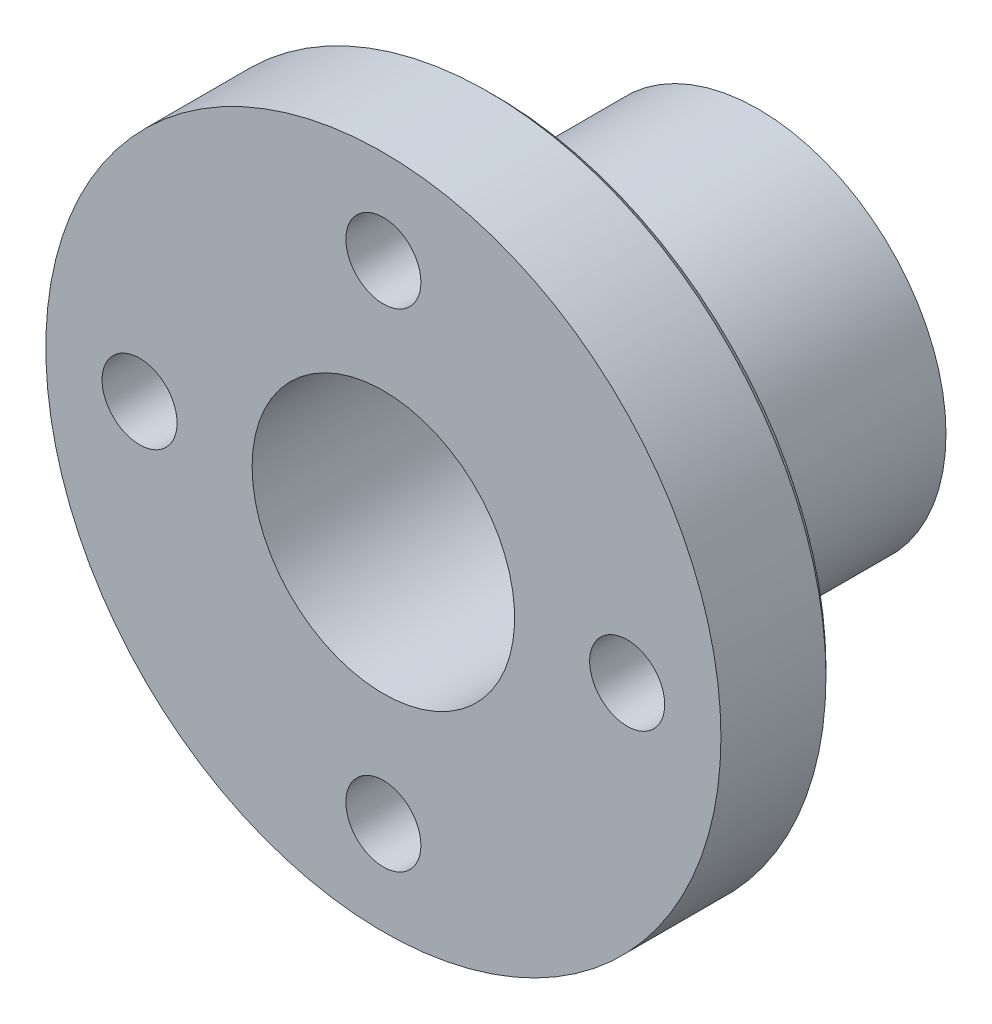
ISO-10303-21;
HEADER;
FILE_DESCRIPTION(('STEP AP214'),'2;1');
FILE_NAME('part.step','',(''),(''),'','','');
FILE_SCHEMA(('AUTOMOTIVE_DESIGN { 1 0 10303 214 1 1 1 1 }'));
ENDSEC;
DATA;
#1=APPLICATION_CONTEXT('core data for automotive mechanical design processes');
#2=APPLICATION_PROTOCOL_DEFINITION('international standard','automotive_design',2000,#1);
#3=PRODUCT_CONTEXT('',#1,'mechanical');
#4=PRODUCT('Part','Part','',(#3));
#5=PRODUCT_RELATED_PRODUCT_CATEGORY('part','',(#4));
#6=PRODUCT_DEFINITION_FORMATION('','',#4);
#7=PRODUCT_DEFINITION_CONTEXT('part definition',#1,'design');
#8=PRODUCT_DEFINITION('design','',#6,#7);
#9=PRODUCT_DEFINITION_SHAPE('','',#8);
#10=(LENGTH_UNIT() NAMED_UNIT(*) SI_UNIT(.MILLI.,.METRE.));
#11=(NAMED_UNIT(*) PLANE_ANGLE_UNIT() SI_UNIT($,.RADIAN.));
#12=(NAMED_UNIT(*) SI_UNIT($,.STERADIAN.) SOLID_ANGLE_UNIT());
#13=UNCERTAINTY_MEASURE_WITH_UNIT(LENGTH_MEASURE(1.E-05),#10,'distance_accuracy_value','');
#14=(GEOMETRIC_REPRESENTATION_CONTEXT(3) GLOBAL_UNCERTAINTY_ASSIGNED_CONTEXT((#13)) GLOBAL_UNIT_ASSIGNED_CONTEXT((#10,
#11,#12)) REPRESENTATION_CONTEXT('',''));
#15=CARTESIAN_POINT('',(0.,0.,0.));
#16=DIRECTION('',(0.,0.,1.));
#17=DIRECTION('',(1.,0.,0.));
#18=AXIS2_PLACEMENT_3D('',#15,#16,#17);
#19=CARTESIAN_POINT('',(0.,0.,-15.));
#20=DIRECTION('',(0.,0.,1.));
#21=DIRECTION('',(1.,0.,0.));
#22=AXIS2_PLACEMENT_3D('',#19,#20,#21);
#23=CYLINDRICAL_SURFACE('',#22,45.);
#24=CARTESIAN_POINT('',(0.,0.,-14.));
#25=DIRECTION('',(0.,0.,1.));
#26=DIRECTION('',(1.,0.,0.));
#27=AXIS2_PLACEMENT_3D('',#24,#25,#26);
#28=CIRCLE('',#27,45.);
#29=CARTESIAN_POINT('',(45.,0.,-14.));
#30=VERTEX_POINT('',#29);
#31=EDGE_CURVE('E47',#30,#30,#28,.T.);
#32=ORIENTED_EDGE('',*,*,#31,.T.);
#33=EDGE_LOOP('',(#32));
#34=FACE_BOUND('',#33,.T.);
#35=CARTESIAN_POINT('',(0.,0.,0.));
#36=DIRECTION('',(0.,0.,1.));
#37=DIRECTION('',(1.,0.,0.));
#38=AXIS2_PLACEMENT_3D('',#35,#36,#37);
#39=CIRCLE('',#38,45.);
#40=CARTESIAN_POINT('',(45.,0.,0.));
#41=VERTEX_POINT('',#40);
#42=EDGE_CURVE('E60',#41,#41,#39,.T.);
#43=ORIENTED_EDGE('',*,*,#42,.F.);
#44=EDGE_LOOP('',(#43));
#45=FACE_BOUND('',#44,.T.);
#46=ADVANCED_FACE('F39',(#34,#45),#23,.T.);
#47=CARTESIAN_POINT('',(0.,0.,-15.));
#48=DIRECTION('',(0.,0.,1.));
#49=DIRECTION('',(1.,0.,0.));
#50=AXIS2_PLACEMENT_3D('',#47,#48,#49);
#51=PLANE('',#50);
#52=CARTESIAN_POINT('',(0.,0.,-15.));
#53=DIRECTION('',(0.,0.,1.));
#54=DIRECTION('',(1.,0.,0.));
#55=AXIS2_PLACEMENT_3D('',#52,#53,#54);
#56=CIRCLE('',#55,44.);
#57=CARTESIAN_POINT('',(44.,0.,-15.));
#58=VERTEX_POINT('',#57);
#59=EDGE_CURVE('E10',#58,#58,#56,.F.);
#60=ORIENTED_EDGE('',*,*,#59,.T.);
#61=EDGE_LOOP('',(#60));
#62=FACE_BOUND('',#61,.T.);
#63=CARTESIAN_POINT('',(0.,0.,-15.));
#64=DIRECTION('',(0.,0.,1.));
#65=DIRECTION('',(1.,0.,0.));
#66=AXIS2_PLACEMENT_3D('',#63,#64,#65);
#67=CIRCLE('',#66,26.);
#68=CARTESIAN_POINT('',(26.,0.,-15.));
#69=VERTEX_POINT('',#68);
#70=EDGE_CURVE('E51',#69,#69,#67,.T.);
#71=ORIENTED_EDGE('',*,*,#70,.T.);
#72=EDGE_LOOP('',(#71));
#73=FACE_BOUND('',#72,.T.);
#74=CARTESIAN_POINT('',(-32.5,3.40419430537206E-13,-15.));
#75=DIRECTION('',(0.,0.,1.));
#76=DIRECTION('',(1.,0.,0.));
#77=AXIS2_PLACEMENT_3D('',#74,#75,#76);
#78=CIRCLE('',#77,5.);
#79=CARTESIAN_POINT('',(-27.5,3.40419430537206E-13,-15.));
#80=VERTEX_POINT('',#79);
#81=EDGE_CURVE('E79',#80,#80,#78,.T.);
#82=ORIENTED_EDGE('',*,*,#81,.T.);
#83=EDGE_LOOP('',(#82));
#84=FACE_BOUND('',#83,.T.);
#85=CARTESIAN_POINT('',(-2.26946287024804E-13,-32.5,-15.));
#86=DIRECTION('',(0.,0.,1.));
#87=DIRECTION('',(1.,0.,0.));
#88=AXIS2_PLACEMENT_3D('',#85,#86,#87);
#89=CIRCLE('',#88,5.);
#90=CARTESIAN_POINT('',(4.99999999999977,-32.5,-15.));
#91=VERTEX_POINT('',#90);
#92=EDGE_CURVE('E73',#91,#91,#89,.T.);
#93=ORIENTED_EDGE('',*,*,#92,.T.);
#94=EDGE_LOOP('',(#93));
#95=FACE_BOUND('',#94,.T.);
#96=CARTESIAN_POINT('',(32.5,-1.13473143512402E-13,-15.));
#97=DIRECTION('',(0.,0.,1.));
#98=DIRECTION('',(1.,0.,0.));
#99=AXIS2_PLACEMENT_3D('',#96,#97,#98);
#100=CIRCLE('',#99,5.);
#101=CARTESIAN_POINT('',(37.5,-1.13473143512402E-13,-15.));
#102=VERTEX_POINT('',#101);
#103=EDGE_CURVE('E67',#102,#102,#100,.T.);
#104=ORIENTED_EDGE('',*,*,#103,.T.);
#105=EDGE_LOOP('',(#104));
#106=FACE_BOUND('',#105,.T.);
#107=CARTESIAN_POINT('',(0.,32.5,-15.));
#108=DIRECTION('',(0.,0.,1.));
#109=DIRECTION('',(1.,0.,0.));
#110=AXIS2_PLACEMENT_3D('',#107,#108,#109);
#111=CIRCLE('',#110,5.);
#112=CARTESIAN_POINT('',(5.,32.5,-15.));
#113=VERTEX_POINT('',#112);
#114=EDGE_CURVE('E63',#113,#113,#111,.T.);
#115=ORIENTED_EDGE('',*,*,#114,.T.);
#116=EDGE_LOOP('',(#115));
#117=FACE_BOUND('',#116,.T.);
#118=ADVANCED_FACE('F119',(#62,#73,#84,#95,#106,#117),#51,.F.);
#119=CARTESIAN_POINT('',(0.,0.,0.));
#120=DIRECTION('',(0.,0.,1.));
#121=DIRECTION('',(1.,0.,0.));
#122=AXIS2_PLACEMENT_3D('',#119,#120,#121);
#123=PLANE('',#122);
#124=CARTESIAN_POINT('',(0.,0.,0.));
#125=DIRECTION('',(0.,0.,1.));
#126=DIRECTION('',(1.,0.,0.));
#127=AXIS2_PLACEMENT_3D('',#124,#125,#126);
#128=CIRCLE('',#127,17.5);
#129=CARTESIAN_POINT('',(-17.5,0.,0.));
#130=VERTEX_POINT('',#129);
#131=EDGE_CURVE('E90',#130,#130,#128,.T.);
#132=ORIENTED_EDGE('',*,*,#131,.F.);
#133=EDGE_LOOP('',(#132));
#134=FACE_BOUND('',#133,.T.);
#135=CARTESIAN_POINT('',(-32.5,3.40419430537206E-13,0.));
#136=DIRECTION('',(0.,0.,1.));
#137=DIRECTION('',(1.,0.,0.));
#138=AXIS2_PLACEMENT_3D('',#135,#136,#137);
#139=CIRCLE('',#138,5.);
#140=CARTESIAN_POINT('',(-27.5,3.40419430537206E-13,0.));
#141=VERTEX_POINT('',#140);
#142=EDGE_CURVE('E82',#141,#141,#139,.T.);
#143=ORIENTED_EDGE('',*,*,#142,.F.);
#144=EDGE_LOOP('',(#143));
#145=FACE_BOUND('',#144,.T.);
#146=CARTESIAN_POINT('',(-2.26946287024804E-13,-32.5,0.));
#147=DIRECTION('',(0.,0.,1.));
#148=DIRECTION('',(1.,0.,0.));
#149=AXIS2_PLACEMENT_3D('',#146,#147,#148);
#150=CIRCLE('',#149,5.);
#151=CARTESIAN_POINT('',(4.99999999999977,-32.5,0.));
#152=VERTEX_POINT('',#151);
#153=EDGE_CURVE('E76',#152,#152,#150,.T.);
#154=ORIENTED_EDGE('',*,*,#153,.F.);
#155=EDGE_LOOP('',(#154));
#156=FACE_BOUND('',#155,.T.);
#157=CARTESIAN_POINT('',(32.5,-1.13473143512402E-13,0.));
#158=DIRECTION('',(0.,0.,1.));
#159=DIRECTION('',(1.,0.,0.));
#160=AXIS2_PLACEMENT_3D('',#157,#158,#159);
#161=CIRCLE('',#160,5.);
#162=CARTESIAN_POINT('',(37.5,-1.13473143512402E-13,0.));
#163=VERTEX_POINT('',#162);
#164=EDGE_CURVE('E70',#163,#163,#161,.T.);
#165=ORIENTED_EDGE('',*,*,#164,.F.);
#166=EDGE_LOOP('',(#165));
#167=FACE_BOUND('',#166,.T.);
#168=CARTESIAN_POINT('',(0.,32.5,0.));
#169=DIRECTION('',(0.,0.,1.));
#170=DIRECTION('',(1.,0.,0.));
#171=AXIS2_PLACEMENT_3D('',#168,#169,#170);
#172=CIRCLE('',#171,5.);
#173=CARTESIAN_POINT('',(5.,32.5,0.));
#174=VERTEX_POINT('',#173);
#175=EDGE_CURVE('E64',#174,#174,#172,.T.);
#176=ORIENTED_EDGE('',*,*,#175,.F.);
#177=EDGE_LOOP('',(#176));
#178=FACE_BOUND('',#177,.T.);
#179=ORIENTED_EDGE('',*,*,#42,.T.);
#180=EDGE_LOOP('',(#179));
#181=FACE_BOUND('',#180,.T.);
#182=ADVANCED_FACE('F124',(#134,#145,#156,#167,#178,#181),#123,.T.);
#183=CARTESIAN_POINT('',(0.,32.5,-15.));
#184=DIRECTION('',(0.,0.,1.));
#185=DIRECTION('',(1.,0.,0.));
#186=AXIS2_PLACEMENT_3D('',#183,#184,#185);
#187=CYLINDRICAL_SURFACE('',#186,5.);
#188=ORIENTED_EDGE('',*,*,#114,.F.);
#189=EDGE_LOOP('',(#188));
#190=FACE_BOUND('',#189,.T.);
#191=ORIENTED_EDGE('',*,*,#175,.T.);
#192=EDGE_LOOP('',(#191));
#193=FACE_BOUND('',#192,.T.);
#194=ADVANCED_FACE('F146',(#190,#193),#187,.F.);
#195=CARTESIAN_POINT('',(32.5,-1.13473143512402E-13,-15.));
#196=DIRECTION('',(0.,0.,1.));
#197=DIRECTION('',(1.,0.,0.));
#198=AXIS2_PLACEMENT_3D('',#195,#196,#197);
#199=CYLINDRICAL_SURFACE('',#198,5.);
#200=ORIENTED_EDGE('',*,*,#103,.F.);
#201=EDGE_LOOP('',(#200));
#202=FACE_BOUND('',#201,.T.);
#203=ORIENTED_EDGE('',*,*,#164,.T.);
#204=EDGE_LOOP('',(#203));
#205=FACE_BOUND('',#204,.T.);
#206=ADVANCED_FACE('F149',(#202,#205),#199,.F.);
#207=CARTESIAN_POINT('',(-2.26946287024804E-13,-32.5,-15.));
#208=DIRECTION('',(0.,0.,1.));
#209=DIRECTION('',(1.,0.,0.));
#210=AXIS2_PLACEMENT_3D('',#207,#208,#209);
#211=CYLINDRICAL_SURFACE('',#210,5.);
#212=ORIENTED_EDGE('',*,*,#92,.F.);
#213=EDGE_LOOP('',(#212));
#214=FACE_BOUND('',#213,.T.);
#215=ORIENTED_EDGE('',*,*,#153,.T.);
#216=EDGE_LOOP('',(#215));
#217=FACE_BOUND('',#216,.T.);
#218=ADVANCED_FACE('F115',(#214,#217),#211,.F.);
#219=CARTESIAN_POINT('',(-32.5,3.40419430537206E-13,-15.));
#220=DIRECTION('',(0.,0.,1.));
#221=DIRECTION('',(1.,0.,0.));
#222=AXIS2_PLACEMENT_3D('',#219,#220,#221);
#223=CYLINDRICAL_SURFACE('',#222,5.);
#224=ORIENTED_EDGE('',*,*,#81,.F.);
#225=EDGE_LOOP('',(#224));
#226=FACE_BOUND('',#225,.T.);
#227=ORIENTED_EDGE('',*,*,#142,.T.);
#228=EDGE_LOOP('',(#227));
#229=FACE_BOUND('',#228,.T.);
#230=ADVANCED_FACE('F108',(#226,#229),#223,.F.);
#231=CARTESIAN_POINT('',(0.,0.,-50.));
#232=DIRECTION('',(0.,0.,1.));
#233=DIRECTION('',(1.,0.,0.));
#234=AXIS2_PLACEMENT_3D('',#231,#232,#233);
#235=CYLINDRICAL_SURFACE('',#234,25.);
#236=CARTESIAN_POINT('',(0.,0.,-16.));
#237=DIRECTION('',(0.,0.,1.));
#238=DIRECTION('',(1.,0.,0.));
#239=AXIS2_PLACEMENT_3D('',#236,#237,#238);
#240=CIRCLE('',#239,25.);
#241=CARTESIAN_POINT('',(25.,0.,-16.));
#242=VERTEX_POINT('',#241);
#243=EDGE_CURVE('E55',#242,#242,#240,.F.);
#244=ORIENTED_EDGE('',*,*,#243,.T.);
#245=EDGE_LOOP('',(#244));
#246=FACE_BOUND('',#245,.T.);
#247=CARTESIAN_POINT('',(0.,0.,-50.));
#248=DIRECTION('',(0.,0.,-1.));
#249=DIRECTION('',(-1.,0.,0.));
#250=AXIS2_PLACEMENT_3D('',#247,#248,#249);
#251=CIRCLE('',#250,25.);
#252=CARTESIAN_POINT('',(-25.,0.,-50.));
#253=VERTEX_POINT('',#252);
#254=EDGE_CURVE('E85',#253,#253,#251,.T.);
#255=ORIENTED_EDGE('',*,*,#254,.F.);
#256=EDGE_LOOP('',(#255));
#257=FACE_BOUND('',#256,.T.);
#258=ADVANCED_FACE('F103',(#246,#257),#235,.T.);
#259=CARTESIAN_POINT('',(0.,0.,-50.));
#260=DIRECTION('',(0.,0.,-1.));
#261=DIRECTION('',(-1.,0.,0.));
#262=AXIS2_PLACEMENT_3D('',#259,#260,#261);
#263=PLANE('',#262);
#264=CARTESIAN_POINT('',(0.,0.,-50.));
#265=DIRECTION('',(0.,0.,-1.));
#266=DIRECTION('',(-1.,0.,0.));
#267=AXIS2_PLACEMENT_3D('',#264,#265,#266);
#268=CIRCLE('',#267,17.5);
#269=CARTESIAN_POINT('',(-17.5,0.,-50.));
#270=VERTEX_POINT('',#269);
#271=EDGE_CURVE('E93',#270,#270,#268,.T.);
#272=ORIENTED_EDGE('',*,*,#271,.F.);
#273=EDGE_LOOP('',(#272));
#274=FACE_BOUND('',#273,.T.);
#275=ORIENTED_EDGE('',*,*,#254,.T.);
#276=EDGE_LOOP('',(#275));
#277=FACE_BOUND('',#276,.T.);
#278=ADVANCED_FACE('F99',(#274,#277),#263,.T.);
#279=CARTESIAN_POINT('',(0.,0.,-16.));
#280=DIRECTION('',(0.,0.,1.));
#281=DIRECTION('',(1.,0.,0.));
#282=AXIS2_PLACEMENT_3D('',#279,#280,#281);
#283=TOROIDAL_SURFACE('',#282,26.,1.);
#284=ORIENTED_EDGE('',*,*,#70,.F.);
#285=EDGE_LOOP('',(#284));
#286=FACE_BOUND('',#285,.T.);
#287=ORIENTED_EDGE('',*,*,#243,.F.);
#288=EDGE_LOOP('',(#287));
#289=FACE_BOUND('',#288,.T.);
#290=ADVANCED_FACE('F102',(#286,#289),#283,.F.);
#291=CARTESIAN_POINT('',(0.,0.,-14.));
#292=DIRECTION('',(0.,0.,1.));
#293=DIRECTION('',(1.,0.,0.));
#294=AXIS2_PLACEMENT_3D('',#291,#292,#293);
#295=CONICAL_SURFACE('',#294,45.,0.785398163397455);
#296=ORIENTED_EDGE('',*,*,#59,.F.);
#297=EDGE_LOOP('',(#296));
#298=FACE_BOUND('',#297,.T.);
#299=ORIENTED_EDGE('',*,*,#31,.F.);
#300=EDGE_LOOP('',(#299));
#301=FACE_BOUND('',#300,.T.);
#302=ADVANCED_FACE('F42',(#298,#301),#295,.T.);
#303=CARTESIAN_POINT('',(0.,0.,9.00000000000005));
#304=DIRECTION('',(0.,0.,-1.));
#305=DIRECTION('',(-1.,0.,0.));
#306=AXIS2_PLACEMENT_3D('',#303,#304,#305);
#307=CYLINDRICAL_SURFACE('',#306,17.5);
#308=CARTESIAN_POINT('',(-17.5,0.,0.));
#309=CARTESIAN_POINT('',(-17.5,0.,-0.520833333333334));
#310=CARTESIAN_POINT('',(-17.5,0.,-1.04166666666667));
#311=CARTESIAN_POINT('',(-17.5,0.,-2.08333333333333));
#312=CARTESIAN_POINT('',(-17.5,0.,-2.60416666666667));
#313=CARTESIAN_POINT('',(-17.5,0.,-3.64583333333333));
#314=CARTESIAN_POINT('',(-17.5,0.,-4.16666666666667));
#315=CARTESIAN_POINT('',(-17.5,0.,-5.20833333333334));
#316=CARTESIAN_POINT('',(-17.5,0.,-5.72916666666667));
#317=CARTESIAN_POINT('',(-17.5,0.,-6.77083333333333));
#318=CARTESIAN_POINT('',(-17.5,0.,-7.29166666666667));
#319=CARTESIAN_POINT('',(-17.5,0.,-8.33333333333333));
#320=CARTESIAN_POINT('',(-17.5,0.,-8.85416666666667));
#321=CARTESIAN_POINT('',(-17.5,0.,-9.89583333333333));
#322=CARTESIAN_POINT('',(-17.5,0.,-10.4166666666667));
#323=CARTESIAN_POINT('',(-17.5,0.,-11.4583333333333));
#324=CARTESIAN_POINT('',(-17.5,0.,-11.9791666666667));
#325=CARTESIAN_POINT('',(-17.5,0.,-13.0208333333333));
#326=CARTESIAN_POINT('',(-17.5,0.,-13.5416666666667));
#327=CARTESIAN_POINT('',(-17.5,0.,-14.5833333333333));
#328=CARTESIAN_POINT('',(-17.5,0.,-15.1041666666667));
#329=CARTESIAN_POINT('',(-17.5,0.,-16.1458333333333));
#330=CARTESIAN_POINT('',(-17.5,0.,-16.6666666666667));
#331=CARTESIAN_POINT('',(-17.5,0.,-17.7083333333333));
#332=CARTESIAN_POINT('',(-17.5,0.,-18.2291666666667));
#333=CARTESIAN_POINT('',(-17.5,0.,-19.2708333333333));
#334=CARTESIAN_POINT('',(-17.5,0.,-19.7916666666667));
#335=CARTESIAN_POINT('',(-17.5,0.,-20.8333333333333));
#336=CARTESIAN_POINT('',(-17.5,0.,-21.3541666666667));
#337=CARTESIAN_POINT('',(-17.5,0.,-22.3958333333333));
#338=CARTESIAN_POINT('',(-17.5,0.,-22.9166666666667));
#339=CARTESIAN_POINT('',(-17.5,0.,-23.9583333333333));
#340=CARTESIAN_POINT('',(-17.5,0.,-24.4791666666667));
#341=CARTESIAN_POINT('',(-17.5,0.,-25.5208333333333));
#342=CARTESIAN_POINT('',(-17.5,0.,-26.0416666666667));
#343=CARTESIAN_POINT('',(-17.5,0.,-27.0833333333333));
#344=CARTESIAN_POINT('',(-17.5,0.,-27.6041666666667));
#345=CARTESIAN_POINT('',(-17.5,0.,-28.6458333333333));
#346=CARTESIAN_POINT('',(-17.5,0.,-29.1666666666667));
#347=CARTESIAN_POINT('',(-17.5,0.,-30.2083333333333));
#348=CARTESIAN_POINT('',(-17.5,0.,-30.7291666666667));
#349=CARTESIAN_POINT('',(-17.5,0.,-31.7708333333333));
#350=CARTESIAN_POINT('',(-17.5,0.,-32.2916666666667));
#351=CARTESIAN_POINT('',(-17.5,0.,-33.3333333333333));
#352=CARTESIAN_POINT('',(-17.5,0.,-33.8541666666667));
#353=CARTESIAN_POINT('',(-17.5,0.,-34.8958333333333));
#354=CARTESIAN_POINT('',(-17.5,0.,-35.4166666666667));
#355=CARTESIAN_POINT('',(-17.5,0.,-36.4583333333333));
#356=CARTESIAN_POINT('',(-17.5,0.,-36.9791666666667));
#357=CARTESIAN_POINT('',(-17.5,0.,-38.0208333333333));
#358=CARTESIAN_POINT('',(-17.5,0.,-38.5416666666667));
#359=CARTESIAN_POINT('',(-17.5,0.,-39.5833333333333));
#360=CARTESIAN_POINT('',(-17.5,0.,-40.1041666666667));
#361=CARTESIAN_POINT('',(-17.5,0.,-41.1458333333333));
#362=CARTESIAN_POINT('',(-17.5,0.,-41.6666666666667));
#363=CARTESIAN_POINT('',(-17.5,0.,-42.7083333333333));
#364=CARTESIAN_POINT('',(-17.5,0.,-43.2291666666667));
#365=CARTESIAN_POINT('',(-17.5,0.,-44.2708333333333));
#366=CARTESIAN_POINT('',(-17.5,0.,-44.7916666666667));
#367=CARTESIAN_POINT('',(-17.5,0.,-45.8333333333333));
#368=CARTESIAN_POINT('',(-17.5,0.,-46.3541666666667));
#369=CARTESIAN_POINT('',(-17.5,0.,-47.3958333333333));
#370=CARTESIAN_POINT('',(-17.5,0.,-47.9166666666667));
#371=CARTESIAN_POINT('',(-17.5,0.,-48.9583333333333));
#372=CARTESIAN_POINT('',(-17.5,0.,-49.4791666666667));
#373=CARTESIAN_POINT('',(-17.5,0.,-50.));
#374=B_SPLINE_CURVE_WITH_KNOTS('',3,(#308,#309,#310,#311,#312,#313,#314,#315,#316,#317,#318,
#319,#320,#321,#322,#323,#324,#325,#326,#327,#328,#329,#330,#331,#332,#333,#334,#335,#336,#337,
#338,#339,#340,#341,#342,#343,#344,#345,#346,#347,#348,#349,#350,#351,#352,#353,#354,#355,#356,
#357,#358,#359,#360,#361,#362,#363,#364,#365,#366,#367,#368,#369,#370,#371,#372,#373),
.UNSPECIFIED.,.F.,.F.,(4,2,2,2,2,2,2,2,2,2,2,2,2,2,2,2,2,2,2,2,2,2,2,2,2,2,2,2,2,2,2,2,4),(0.,
1.5625,3.125,4.6875,6.25,7.8125,9.375,10.9375,12.5,14.0625,15.625,17.1875,18.75,20.3125,21.875,
23.4375,25.,26.5625,28.125,29.6875,31.25,32.8125,34.375,35.9375,37.5,39.0625,40.625,42.1875,
43.75,45.3125,46.875,48.4375,50.),.UNSPECIFIED.);
#375=EDGE_CURVE('BSEAM97',#130,#270,#374,.T.);
#376=ORIENTED_EDGE('',*,*,#131,.T.);
#377=ORIENTED_EDGE('',*,*,#271,.T.);
#378=ORIENTED_EDGE('',*,*,#375,.T.);
#379=ORIENTED_EDGE('',*,*,#375,.F.);
#380=EDGE_LOOP('',(#376,#378,#377,#379));
#381=FACE_BOUND('',#380,.T.);
#382=ADVANCED_FACE('F97',(#381),#307,.F.);
#383=CLOSED_SHELL('',(#46,#118,#182,#194,#206,#218,#230,#258,#278,#290,#302,#382));
#384=MANIFOLD_SOLID_BREP('B2',#383);
#385=ADVANCED_BREP_SHAPE_REPRESENTATION('',(#18,#384),#14);
#386=SHAPE_DEFINITION_REPRESENTATION(#9,#385);
ENDSEC;
END-ISO-10303-21;
